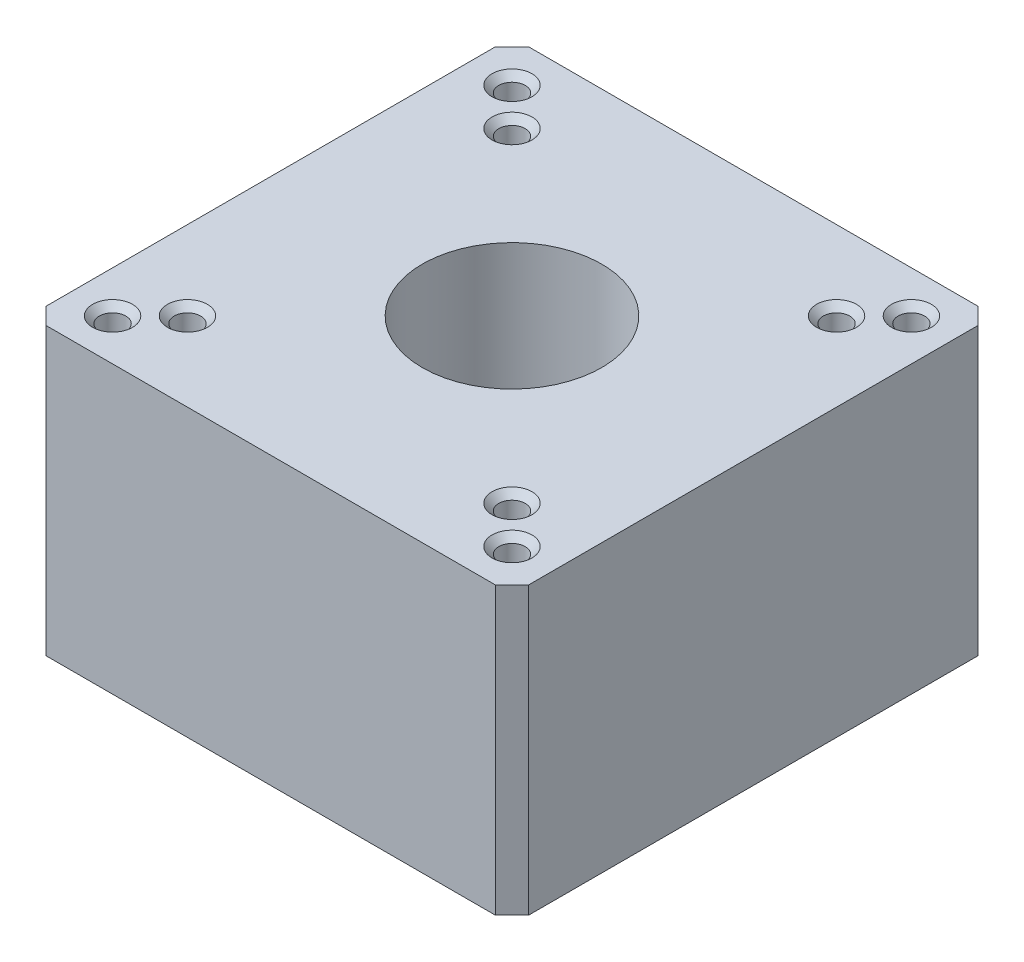
ISO-10303-21;
HEADER;
FILE_DESCRIPTION(('STEP AP214'),'2;1');
FILE_NAME('part.step','',(''),(''),'','','');
FILE_SCHEMA(('AUTOMOTIVE_DESIGN { 1 0 10303 214 1 1 1 1 }'));
ENDSEC;
DATA;
#1=APPLICATION_CONTEXT('core data for automotive mechanical design processes');
#2=APPLICATION_PROTOCOL_DEFINITION('international standard','automotive_design',2000,#1);
#3=PRODUCT_CONTEXT('',#1,'mechanical');
#4=PRODUCT('Part','Part','',(#3));
#5=PRODUCT_RELATED_PRODUCT_CATEGORY('part','',(#4));
#6=PRODUCT_DEFINITION_FORMATION('','',#4);
#7=PRODUCT_DEFINITION_CONTEXT('part definition',#1,'design');
#8=PRODUCT_DEFINITION('design','',#6,#7);
#9=PRODUCT_DEFINITION_SHAPE('','',#8);
#10=(LENGTH_UNIT() NAMED_UNIT(*) SI_UNIT(.MILLI.,.METRE.));
#11=(NAMED_UNIT(*) PLANE_ANGLE_UNIT() SI_UNIT($,.RADIAN.));
#12=(NAMED_UNIT(*) SI_UNIT($,.STERADIAN.) SOLID_ANGLE_UNIT());
#13=UNCERTAINTY_MEASURE_WITH_UNIT(LENGTH_MEASURE(1.E-05),#10,'distance_accuracy_value','');
#14=(GEOMETRIC_REPRESENTATION_CONTEXT(3) GLOBAL_UNCERTAINTY_ASSIGNED_CONTEXT((#13)) GLOBAL_UNIT_ASSIGNED_CONTEXT((#10,
#11,#12)) REPRESENTATION_CONTEXT('',''));
#15=CARTESIAN_POINT('',(0.,0.,0.));
#16=DIRECTION('',(0.,0.,1.));
#17=DIRECTION('',(1.,0.,0.));
#18=AXIS2_PLACEMENT_3D('',#15,#16,#17);
#19=CARTESIAN_POINT('',(0.,43.65625,0.));
#20=DIRECTION('',(0.,1.,0.));
#21=DIRECTION('',(0.,0.,1.));
#22=AXIS2_PLACEMENT_3D('',#19,#20,#21);
#23=PLANE('',#22);
#24=CARTESIAN_POINT('',(-24.765,43.65625,-24.765));
#25=DIRECTION('',(0.,1.,0.));
#26=DIRECTION('',(0.,0.,1.));
#27=AXIS2_PLACEMENT_3D('',#24,#25,#26);
#28=CIRCLE('',#27,3.048);
#29=CARTESIAN_POINT('',(-24.765,43.65625,-21.717));
#30=VERTEX_POINT('',#29);
#31=EDGE_CURVE('E153',#30,#30,#28,.T.);
#32=ORIENTED_EDGE('',*,*,#31,.F.);
#33=EDGE_LOOP('',(#32));
#34=FACE_BOUND('',#33,.T.);
#35=CARTESIAN_POINT('',(24.765,43.65625,-24.765));
#36=DIRECTION('',(0.,1.,0.));
#37=DIRECTION('',(0.,0.,1.));
#38=AXIS2_PLACEMENT_3D('',#35,#36,#37);
#39=CIRCLE('',#38,3.048);
#40=CARTESIAN_POINT('',(24.765,43.65625,-21.717));
#41=VERTEX_POINT('',#40);
#42=EDGE_CURVE('E144',#41,#41,#39,.T.);
#43=ORIENTED_EDGE('',*,*,#42,.F.);
#44=EDGE_LOOP('',(#43));
#45=FACE_BOUND('',#44,.T.);
#46=CARTESIAN_POINT('',(-24.765,43.65625,24.765));
#47=DIRECTION('',(0.,1.,0.));
#48=DIRECTION('',(0.,0.,1.));
#49=AXIS2_PLACEMENT_3D('',#46,#47,#48);
#50=CIRCLE('',#49,3.048);
#51=CARTESIAN_POINT('',(-24.765,43.65625,27.813));
#52=VERTEX_POINT('',#51);
#53=EDGE_CURVE('E165',#52,#52,#50,.T.);
#54=ORIENTED_EDGE('',*,*,#53,.F.);
#55=EDGE_LOOP('',(#54));
#56=FACE_BOUND('',#55,.T.);
#57=CARTESIAN_POINT('',(24.765,43.65625,24.765));
#58=DIRECTION('',(0.,1.,0.));
#59=DIRECTION('',(0.,0.,1.));
#60=AXIS2_PLACEMENT_3D('',#57,#58,#59);
#61=CIRCLE('',#60,3.048);
#62=CARTESIAN_POINT('',(24.765,43.65625,27.813));
#63=VERTEX_POINT('',#62);
#64=EDGE_CURVE('E176',#63,#63,#61,.T.);
#65=ORIENTED_EDGE('',*,*,#64,.F.);
#66=EDGE_LOOP('',(#65));
#67=FACE_BOUND('',#66,.T.);
#68=CARTESIAN_POINT('',(30.48,43.65625,-30.48));
#69=DIRECTION('',(0.,1.,0.));
#70=DIRECTION('',(0.,0.,1.));
#71=AXIS2_PLACEMENT_3D('',#68,#69,#70);
#72=CIRCLE('',#71,3.048);
#73=CARTESIAN_POINT('',(30.48,43.65625,-27.432));
#74=VERTEX_POINT('',#73);
#75=EDGE_CURVE('E189',#74,#74,#72,.T.);
#76=ORIENTED_EDGE('',*,*,#75,.F.);
#77=EDGE_LOOP('',(#76));
#78=FACE_BOUND('',#77,.T.);
#79=CARTESIAN_POINT('',(-30.48,43.65625,-30.48));
#80=DIRECTION('',(0.,1.,0.));
#81=DIRECTION('',(0.,0.,1.));
#82=AXIS2_PLACEMENT_3D('',#79,#80,#81);
#83=CIRCLE('',#82,3.048);
#84=CARTESIAN_POINT('',(-30.48,43.65625,-27.432));
#85=VERTEX_POINT('',#84);
#86=EDGE_CURVE('E199',#85,#85,#83,.T.);
#87=ORIENTED_EDGE('',*,*,#86,.F.);
#88=EDGE_LOOP('',(#87));
#89=FACE_BOUND('',#88,.T.);
#90=CARTESIAN_POINT('',(-30.48,43.65625,30.48));
#91=DIRECTION('',(0.,1.,0.));
#92=DIRECTION('',(0.,0.,1.));
#93=AXIS2_PLACEMENT_3D('',#90,#91,#92);
#94=CIRCLE('',#93,3.048);
#95=CARTESIAN_POINT('',(-30.48,43.65625,33.528));
#96=VERTEX_POINT('',#95);
#97=EDGE_CURVE('E215',#96,#96,#94,.T.);
#98=ORIENTED_EDGE('',*,*,#97,.F.);
#99=EDGE_LOOP('',(#98));
#100=FACE_BOUND('',#99,.T.);
#101=CARTESIAN_POINT('',(30.48,43.65625,30.48));
#102=DIRECTION('',(0.,1.,0.));
#103=DIRECTION('',(0.,0.,1.));
#104=AXIS2_PLACEMENT_3D('',#101,#102,#103);
#105=CIRCLE('',#104,3.048);
#106=CARTESIAN_POINT('',(30.48,43.65625,33.528));
#107=VERTEX_POINT('',#106);
#108=EDGE_CURVE('E223',#107,#107,#105,.T.);
#109=ORIENTED_EDGE('',*,*,#108,.F.);
#110=EDGE_LOOP('',(#109));
#111=FACE_BOUND('',#110,.T.);
#112=DIRECTION('',(0.,0.,-1.));
#113=VECTOR('',#112,1.);
#114=CARTESIAN_POINT('',(36.83,43.65625,36.83));
#115=LINE('',#114,#113);
#116=CARTESIAN_POINT('',(36.83,43.65625,34.29));
#117=VERTEX_POINT('',#116);
#118=CARTESIAN_POINT('',(36.83,43.65625,-34.29));
#119=VERTEX_POINT('',#118);
#120=EDGE_CURVE('E255',#117,#119,#115,.T.);
#121=ORIENTED_EDGE('',*,*,#120,.T.);
#122=DIRECTION('',(0.707106781186548,0.,0.707106781186548));
#123=VECTOR('',#122,1.);
#124=CARTESIAN_POINT('',(35.56,43.65625,-35.56));
#125=LINE('',#124,#123);
#126=CARTESIAN_POINT('',(34.29,43.65625,-36.83));
#127=VERTEX_POINT('',#126);
#128=EDGE_CURVE('E310',#119,#127,#125,.F.);
#129=ORIENTED_EDGE('',*,*,#128,.T.);
#130=DIRECTION('',(-1.,0.,0.));
#131=VECTOR('',#130,1.);
#132=CARTESIAN_POINT('',(36.83,43.65625,-36.83));
#133=LINE('',#132,#131);
#134=CARTESIAN_POINT('',(-34.29,43.65625,-36.83));
#135=VERTEX_POINT('',#134);
#136=EDGE_CURVE('E257',#127,#135,#133,.T.);
#137=ORIENTED_EDGE('',*,*,#136,.T.);
#138=DIRECTION('',(0.707106781186548,0.,-0.707106781186548));
#139=VECTOR('',#138,1.);
#140=CARTESIAN_POINT('',(-35.56,43.65625,-35.56));
#141=LINE('',#140,#139);
#142=CARTESIAN_POINT('',(-36.83,43.65625,-34.29));
#143=VERTEX_POINT('',#142);
#144=EDGE_CURVE('E302',#135,#143,#141,.F.);
#145=ORIENTED_EDGE('',*,*,#144,.T.);
#146=DIRECTION('',(0.,0.,1.));
#147=VECTOR('',#146,1.);
#148=CARTESIAN_POINT('',(-36.83,43.65625,36.83));
#149=LINE('',#148,#147);
#150=CARTESIAN_POINT('',(-36.83,43.65625,34.29));
#151=VERTEX_POINT('',#150);
#152=EDGE_CURVE('E244',#143,#151,#149,.T.);
#153=ORIENTED_EDGE('',*,*,#152,.T.);
#154=DIRECTION('',(-0.707106781186548,0.,-0.707106781186548));
#155=VECTOR('',#154,1.);
#156=CARTESIAN_POINT('',(-35.56,43.65625,35.56));
#157=LINE('',#156,#155);
#158=CARTESIAN_POINT('',(-34.29,43.65625,36.83));
#159=VERTEX_POINT('',#158);
#160=EDGE_CURVE('E76',#151,#159,#157,.F.);
#161=ORIENTED_EDGE('',*,*,#160,.T.);
#162=DIRECTION('',(1.,0.,0.));
#163=VECTOR('',#162,1.);
#164=CARTESIAN_POINT('',(36.83,43.65625,36.83));
#165=LINE('',#164,#163);
#166=CARTESIAN_POINT('',(34.29,43.65625,36.83));
#167=VERTEX_POINT('',#166);
#168=EDGE_CURVE('E247',#159,#167,#165,.T.);
#169=ORIENTED_EDGE('',*,*,#168,.T.);
#170=DIRECTION('',(-0.707106781186549,0.,0.707106781186546));
#171=VECTOR('',#170,1.);
#172=CARTESIAN_POINT('',(35.5599999999999,43.65625,35.5600000000001));
#173=LINE('',#172,#171);
#174=EDGE_CURVE('E299',#167,#117,#173,.F.);
#175=ORIENTED_EDGE('',*,*,#174,.T.);
#176=EDGE_LOOP('',(#121,#129,#137,#145,#153,#161,#169,#175));
#177=FACE_BOUND('',#176,.T.);
#178=CARTESIAN_POINT('',(0.,43.65625,0.));
#179=DIRECTION('',(0.,1.,0.));
#180=DIRECTION('',(0.,0.,1.));
#181=AXIS2_PLACEMENT_3D('',#178,#179,#180);
#182=CIRCLE('',#181,13.6921875);
#183=CARTESIAN_POINT('',(0.,43.65625,13.6921875));
#184=VERTEX_POINT('',#183);
#185=EDGE_CURVE('E240',#184,#184,#182,.T.);
#186=ORIENTED_EDGE('',*,*,#185,.F.);
#187=EDGE_LOOP('',(#186));
#188=FACE_BOUND('',#187,.T.);
#189=ADVANCED_FACE('F54',(#34,#45,#56,#67,#78,#89,#100,#111,#177,#188),#23,.T.);
#190=CARTESIAN_POINT('',(0.,0.,0.));
#191=DIRECTION('',(0.,1.,0.));
#192=DIRECTION('',(0.,0.,1.));
#193=AXIS2_PLACEMENT_3D('',#190,#191,#192);
#194=PLANE('',#193);
#195=CARTESIAN_POINT('',(30.48,0.,-30.48));
#196=DIRECTION('',(0.,1.,0.));
#197=DIRECTION('',(0.,0.,1.));
#198=AXIS2_PLACEMENT_3D('',#195,#196,#197);
#199=CIRCLE('',#198,2.01929999999999);
#200=CARTESIAN_POINT('',(30.48,0.,-28.4607));
#201=VERTEX_POINT('',#200);
#202=EDGE_CURVE('E196',#201,#201,#199,.T.);
#203=ORIENTED_EDGE('',*,*,#202,.T.);
#204=EDGE_LOOP('',(#203));
#205=FACE_BOUND('',#204,.T.);
#206=CARTESIAN_POINT('',(-30.48,0.,-30.48));
#207=DIRECTION('',(0.,1.,0.));
#208=DIRECTION('',(0.,0.,1.));
#209=AXIS2_PLACEMENT_3D('',#206,#207,#208);
#210=CIRCLE('',#209,2.01929999999999);
#211=CARTESIAN_POINT('',(-30.48,0.,-28.4607));
#212=VERTEX_POINT('',#211);
#213=EDGE_CURVE('E206',#212,#212,#210,.T.);
#214=ORIENTED_EDGE('',*,*,#213,.T.);
#215=EDGE_LOOP('',(#214));
#216=FACE_BOUND('',#215,.T.);
#217=CARTESIAN_POINT('',(-30.48,0.,30.48));
#218=DIRECTION('',(0.,1.,0.));
#219=DIRECTION('',(0.,0.,1.));
#220=AXIS2_PLACEMENT_3D('',#217,#218,#219);
#221=CIRCLE('',#220,2.01929999999999);
#222=CARTESIAN_POINT('',(-30.48,0.,32.4993));
#223=VERTEX_POINT('',#222);
#224=EDGE_CURVE('E219',#223,#223,#221,.T.);
#225=ORIENTED_EDGE('',*,*,#224,.T.);
#226=EDGE_LOOP('',(#225));
#227=FACE_BOUND('',#226,.T.);
#228=CARTESIAN_POINT('',(30.48,0.,30.48));
#229=DIRECTION('',(0.,1.,0.));
#230=DIRECTION('',(0.,0.,1.));
#231=AXIS2_PLACEMENT_3D('',#228,#229,#230);
#232=CIRCLE('',#231,2.01929999999999);
#233=CARTESIAN_POINT('',(30.48,0.,32.4993));
#234=VERTEX_POINT('',#233);
#235=EDGE_CURVE('E235',#234,#234,#232,.T.);
#236=ORIENTED_EDGE('',*,*,#235,.T.);
#237=EDGE_LOOP('',(#236));
#238=FACE_BOUND('',#237,.T.);
#239=DIRECTION('',(-1.,0.,0.));
#240=VECTOR('',#239,1.);
#241=CARTESIAN_POINT('',(36.83,0.,-36.83));
#242=LINE('',#241,#240);
#243=CARTESIAN_POINT('',(34.29,0.,-36.83));
#244=VERTEX_POINT('',#243);
#245=CARTESIAN_POINT('',(-34.29,0.,-36.83));
#246=VERTEX_POINT('',#245);
#247=EDGE_CURVE('E248',#244,#246,#242,.T.);
#248=ORIENTED_EDGE('',*,*,#247,.F.);
#249=DIRECTION('',(-0.707106781186548,0.,-0.707106781186548));
#250=VECTOR('',#249,1.);
#251=CARTESIAN_POINT('',(34.29,0.,-36.83));
#252=LINE('',#251,#250);
#253=CARTESIAN_POINT('',(36.83,0.,-34.29));
#254=VERTEX_POINT('',#253);
#255=EDGE_CURVE('E288',#244,#254,#252,.F.);
#256=ORIENTED_EDGE('',*,*,#255,.T.);
#257=DIRECTION('',(0.,0.,-1.));
#258=VECTOR('',#257,1.);
#259=CARTESIAN_POINT('',(36.83,0.,36.83));
#260=LINE('',#259,#258);
#261=CARTESIAN_POINT('',(36.83,0.,34.29));
#262=VERTEX_POINT('',#261);
#263=EDGE_CURVE('E270',#262,#254,#260,.T.);
#264=ORIENTED_EDGE('',*,*,#263,.F.);
#265=DIRECTION('',(0.707106781186549,0.,-0.707106781186546));
#266=VECTOR('',#265,1.);
#267=CARTESIAN_POINT('',(36.83,0.,34.29));
#268=LINE('',#267,#266);
#269=CARTESIAN_POINT('',(34.29,0.,36.83));
#270=VERTEX_POINT('',#269);
#271=EDGE_CURVE('E278',#262,#270,#268,.F.);
#272=ORIENTED_EDGE('',*,*,#271,.T.);
#273=DIRECTION('',(1.,0.,0.));
#274=VECTOR('',#273,1.);
#275=CARTESIAN_POINT('',(36.83,0.,36.83));
#276=LINE('',#275,#274);
#277=CARTESIAN_POINT('',(-34.29,0.,36.83));
#278=VERTEX_POINT('',#277);
#279=EDGE_CURVE('E262',#278,#270,#276,.T.);
#280=ORIENTED_EDGE('',*,*,#279,.F.);
#281=DIRECTION('',(0.707106781186548,0.,0.707106781186548));
#282=VECTOR('',#281,1.);
#283=CARTESIAN_POINT('',(-34.29,0.,36.83));
#284=LINE('',#283,#282);
#285=CARTESIAN_POINT('',(-36.83,0.,34.29));
#286=VERTEX_POINT('',#285);
#287=EDGE_CURVE('E283',#278,#286,#284,.F.);
#288=ORIENTED_EDGE('',*,*,#287,.T.);
#289=DIRECTION('',(0.,0.,1.));
#290=VECTOR('',#289,1.);
#291=CARTESIAN_POINT('',(-36.83,0.,36.83));
#292=LINE('',#291,#290);
#293=CARTESIAN_POINT('',(-36.83,0.,-34.29));
#294=VERTEX_POINT('',#293);
#295=EDGE_CURVE('E241',#294,#286,#292,.T.);
#296=ORIENTED_EDGE('',*,*,#295,.F.);
#297=DIRECTION('',(-0.707106781186548,0.,0.707106781186548));
#298=VECTOR('',#297,1.);
#299=CARTESIAN_POINT('',(-36.83,0.,-34.29));
#300=LINE('',#299,#298);
#301=EDGE_CURVE('E286',#294,#246,#300,.F.);
#302=ORIENTED_EDGE('',*,*,#301,.T.);
#303=EDGE_LOOP('',(#248,#256,#264,#272,#280,#288,#296,#302));
#304=FACE_BOUND('',#303,.T.);
#305=CARTESIAN_POINT('',(0.,0.,0.));
#306=DIRECTION('',(0.,1.,0.));
#307=DIRECTION('',(0.,0.,1.));
#308=AXIS2_PLACEMENT_3D('',#305,#306,#307);
#309=CIRCLE('',#308,13.6921875);
#310=CARTESIAN_POINT('',(0.,0.,13.6921875));
#311=VERTEX_POINT('',#310);
#312=EDGE_CURVE('E236',#311,#311,#309,.T.);
#313=ORIENTED_EDGE('',*,*,#312,.T.);
#314=EDGE_LOOP('',(#313));
#315=FACE_BOUND('',#314,.T.);
#316=ADVANCED_FACE('F330',(#205,#216,#227,#238,#304,#315),#194,.F.);
#317=CARTESIAN_POINT('',(-36.83,43.65625,36.83));
#318=DIRECTION('',(1.,0.,0.));
#319=DIRECTION('',(0.,0.,-1.));
#320=AXIS2_PLACEMENT_3D('',#317,#318,#319);
#321=PLANE('',#320);
#322=ORIENTED_EDGE('',*,*,#152,.F.);
#323=DIRECTION('',(0.,-1.,0.));
#324=VECTOR('',#323,1.);
#325=CARTESIAN_POINT('',(-36.83,43.65625,-34.29));
#326=LINE('',#325,#324);
#327=EDGE_CURVE('E312',#143,#294,#326,.T.);
#328=ORIENTED_EDGE('',*,*,#327,.T.);
#329=ORIENTED_EDGE('',*,*,#295,.T.);
#330=DIRECTION('',(0.,1.,0.));
#331=VECTOR('',#330,1.);
#332=CARTESIAN_POINT('',(-36.83,43.65625,34.29));
#333=LINE('',#332,#331);
#334=EDGE_CURVE('E309',#286,#151,#333,.T.);
#335=ORIENTED_EDGE('',*,*,#334,.T.);
#336=EDGE_LOOP('',(#322,#328,#329,#335));
#337=FACE_BOUND('',#336,.T.);
#338=ADVANCED_FACE('F322',(#337),#321,.F.);
#339=CARTESIAN_POINT('',(36.83,43.65625,36.83));
#340=DIRECTION('',(0.,0.,-1.));
#341=DIRECTION('',(-1.,0.,0.));
#342=AXIS2_PLACEMENT_3D('',#339,#340,#341);
#343=PLANE('',#342);
#344=ORIENTED_EDGE('',*,*,#168,.F.);
#345=DIRECTION('',(0.,-1.,0.));
#346=VECTOR('',#345,1.);
#347=CARTESIAN_POINT('',(-34.29,43.65625,36.83));
#348=LINE('',#347,#346);
#349=EDGE_CURVE('E11',#159,#278,#348,.T.);
#350=ORIENTED_EDGE('',*,*,#349,.T.);
#351=ORIENTED_EDGE('',*,*,#279,.T.);
#352=DIRECTION('',(0.,1.,0.));
#353=VECTOR('',#352,1.);
#354=CARTESIAN_POINT('',(34.29,43.65625,36.83));
#355=LINE('',#354,#353);
#356=EDGE_CURVE('E63',#270,#167,#355,.T.);
#357=ORIENTED_EDGE('',*,*,#356,.T.);
#358=EDGE_LOOP('',(#344,#350,#351,#357));
#359=FACE_BOUND('',#358,.T.);
#360=ADVANCED_FACE('F332',(#359),#343,.F.);
#361=CARTESIAN_POINT('',(36.83,43.65625,36.83));
#362=DIRECTION('',(-1.,0.,0.));
#363=DIRECTION('',(0.,0.,1.));
#364=AXIS2_PLACEMENT_3D('',#361,#362,#363);
#365=PLANE('',#364);
#366=ORIENTED_EDGE('',*,*,#263,.T.);
#367=DIRECTION('',(0.,1.,0.));
#368=VECTOR('',#367,1.);
#369=CARTESIAN_POINT('',(36.83,43.65625,-34.29));
#370=LINE('',#369,#368);
#371=EDGE_CURVE('E298',#254,#119,#370,.T.);
#372=ORIENTED_EDGE('',*,*,#371,.T.);
#373=ORIENTED_EDGE('',*,*,#120,.F.);
#374=DIRECTION('',(0.,-1.,0.));
#375=VECTOR('',#374,1.);
#376=CARTESIAN_POINT('',(36.83,43.65625,34.29));
#377=LINE('',#376,#375);
#378=EDGE_CURVE('E292',#117,#262,#377,.T.);
#379=ORIENTED_EDGE('',*,*,#378,.T.);
#380=EDGE_LOOP('',(#366,#372,#373,#379));
#381=FACE_BOUND('',#380,.T.);
#382=ADVANCED_FACE('F342',(#381),#365,.F.);
#383=CARTESIAN_POINT('',(36.83,43.65625,-36.83));
#384=DIRECTION('',(0.,0.,1.));
#385=DIRECTION('',(1.,0.,0.));
#386=AXIS2_PLACEMENT_3D('',#383,#384,#385);
#387=PLANE('',#386);
#388=ORIENTED_EDGE('',*,*,#136,.F.);
#389=DIRECTION('',(0.,-1.,0.));
#390=VECTOR('',#389,1.);
#391=CARTESIAN_POINT('',(34.29,43.65625,-36.83));
#392=LINE('',#391,#390);
#393=EDGE_CURVE('E277',#127,#244,#392,.T.);
#394=ORIENTED_EDGE('',*,*,#393,.T.);
#395=ORIENTED_EDGE('',*,*,#247,.T.);
#396=DIRECTION('',(0.,1.,0.));
#397=VECTOR('',#396,1.);
#398=CARTESIAN_POINT('',(-34.29,43.65625,-36.83));
#399=LINE('',#398,#397);
#400=EDGE_CURVE('E258',#246,#135,#399,.T.);
#401=ORIENTED_EDGE('',*,*,#400,.T.);
#402=EDGE_LOOP('',(#388,#394,#395,#401));
#403=FACE_BOUND('',#402,.T.);
#404=ADVANCED_FACE('F347',(#403),#387,.F.);
#405=CARTESIAN_POINT('',(0.,43.65625,0.));
#406=DIRECTION('',(0.,-1.,0.));
#407=DIRECTION('',(0.,0.,-1.));
#408=AXIS2_PLACEMENT_3D('',#405,#406,#407);
#409=CYLINDRICAL_SURFACE('',#408,13.6921875);
#410=ORIENTED_EDGE('',*,*,#185,.T.);
#411=EDGE_LOOP('',(#410));
#412=FACE_BOUND('',#411,.T.);
#413=ORIENTED_EDGE('',*,*,#312,.F.);
#414=EDGE_LOOP('',(#413));
#415=FACE_BOUND('',#414,.T.);
#416=ADVANCED_FACE('F356',(#412,#415),#409,.F.);
#417=CARTESIAN_POINT('',(34.29,43.65625,-36.83));
#418=DIRECTION('',(-0.707106781186548,0.,0.707106781186548));
#419=DIRECTION('',(0.,-1.,0.));
#420=AXIS2_PLACEMENT_3D('',#417,#418,#419);
#421=PLANE('',#420);
#422=ORIENTED_EDGE('',*,*,#128,.F.);
#423=ORIENTED_EDGE('',*,*,#371,.F.);
#424=ORIENTED_EDGE('',*,*,#255,.F.);
#425=ORIENTED_EDGE('',*,*,#393,.F.);
#426=EDGE_LOOP('',(#422,#423,#424,#425));
#427=FACE_BOUND('',#426,.T.);
#428=ADVANCED_FACE('F346',(#427),#421,.F.);
#429=CARTESIAN_POINT('',(-36.83,43.65625,-34.29));
#430=DIRECTION('',(0.707106781186548,0.,0.707106781186548));
#431=DIRECTION('',(0.,-1.,0.));
#432=AXIS2_PLACEMENT_3D('',#429,#430,#431);
#433=PLANE('',#432);
#434=ORIENTED_EDGE('',*,*,#144,.F.);
#435=ORIENTED_EDGE('',*,*,#400,.F.);
#436=ORIENTED_EDGE('',*,*,#301,.F.);
#437=ORIENTED_EDGE('',*,*,#327,.F.);
#438=EDGE_LOOP('',(#434,#435,#436,#437));
#439=FACE_BOUND('',#438,.T.);
#440=ADVANCED_FACE('F351',(#439),#433,.F.);
#441=CARTESIAN_POINT('',(-34.29,43.65625,36.83));
#442=DIRECTION('',(0.707106781186548,0.,-0.707106781186548));
#443=DIRECTION('',(0.,-1.,0.));
#444=AXIS2_PLACEMENT_3D('',#441,#442,#443);
#445=PLANE('',#444);
#446=ORIENTED_EDGE('',*,*,#160,.F.);
#447=ORIENTED_EDGE('',*,*,#334,.F.);
#448=ORIENTED_EDGE('',*,*,#287,.F.);
#449=ORIENTED_EDGE('',*,*,#349,.F.);
#450=EDGE_LOOP('',(#446,#447,#448,#449));
#451=FACE_BOUND('',#450,.T.);
#452=ADVANCED_FACE('F335',(#451),#445,.F.);
#453=CARTESIAN_POINT('',(36.83,43.65625,34.29));
#454=DIRECTION('',(-0.707106781186546,0.,-0.707106781186549));
#455=DIRECTION('',(0.,-1.,0.));
#456=AXIS2_PLACEMENT_3D('',#453,#454,#455);
#457=PLANE('',#456);
#458=ORIENTED_EDGE('',*,*,#174,.F.);
#459=ORIENTED_EDGE('',*,*,#356,.F.);
#460=ORIENTED_EDGE('',*,*,#271,.F.);
#461=ORIENTED_EDGE('',*,*,#378,.F.);
#462=EDGE_LOOP('',(#458,#459,#460,#461));
#463=FACE_BOUND('',#462,.T.);
#464=ADVANCED_FACE('F59',(#463),#457,.F.);
#465=CARTESIAN_POINT('',(30.48,43.65625,30.48));
#466=DIRECTION('',(0.,1.,0.));
#467=DIRECTION('',(0.,0.,1.));
#468=AXIS2_PLACEMENT_3D('',#465,#466,#467);
#469=CYLINDRICAL_SURFACE('',#468,2.01929999999999);
#470=ORIENTED_EDGE('',*,*,#235,.F.);
#471=EDGE_LOOP('',(#470));
#472=FACE_BOUND('',#471,.T.);
#473=CARTESIAN_POINT('',(30.48,42.62755,30.48));
#474=DIRECTION('',(0.,1.,0.));
#475=DIRECTION('',(0.,0.,1.));
#476=AXIS2_PLACEMENT_3D('',#473,#474,#475);
#477=CIRCLE('',#476,2.0193);
#478=CARTESIAN_POINT('',(30.48,42.62755,32.4993));
#479=VERTEX_POINT('',#478);
#480=EDGE_CURVE('E226',#479,#479,#477,.T.);
#481=ORIENTED_EDGE('',*,*,#480,.T.);
#482=EDGE_LOOP('',(#481));
#483=FACE_BOUND('',#482,.T.);
#484=ADVANCED_FACE('F445',(#472,#483),#469,.F.);
#485=CARTESIAN_POINT('',(30.48,43.65625,30.48));
#486=DIRECTION('',(0.,1.,0.));
#487=DIRECTION('',(0.,0.,1.));
#488=AXIS2_PLACEMENT_3D('',#485,#486,#487);
#489=CONICAL_SURFACE('',#488,3.048,0.785398163397448);
#490=ORIENTED_EDGE('',*,*,#480,.F.);
#491=EDGE_LOOP('',(#490));
#492=FACE_BOUND('',#491,.T.);
#493=ORIENTED_EDGE('',*,*,#108,.T.);
#494=EDGE_LOOP('',(#493));
#495=FACE_BOUND('',#494,.T.);
#496=ADVANCED_FACE('F452',(#492,#495),#489,.F.);
#497=CARTESIAN_POINT('',(-30.48,43.65625,30.48));
#498=DIRECTION('',(0.,1.,0.));
#499=DIRECTION('',(0.,0.,1.));
#500=AXIS2_PLACEMENT_3D('',#497,#498,#499);
#501=CYLINDRICAL_SURFACE('',#500,2.01929999999999);
#502=ORIENTED_EDGE('',*,*,#224,.F.);
#503=EDGE_LOOP('',(#502));
#504=FACE_BOUND('',#503,.T.);
#505=CARTESIAN_POINT('',(-30.48,42.62755,30.48));
#506=DIRECTION('',(0.,1.,0.));
#507=DIRECTION('',(0.,0.,1.));
#508=AXIS2_PLACEMENT_3D('',#505,#506,#507);
#509=CIRCLE('',#508,2.0193);
#510=CARTESIAN_POINT('',(-30.48,42.62755,32.4993));
#511=VERTEX_POINT('',#510);
#512=EDGE_CURVE('E216',#511,#511,#509,.T.);
#513=ORIENTED_EDGE('',*,*,#512,.T.);
#514=EDGE_LOOP('',(#513));
#515=FACE_BOUND('',#514,.T.);
#516=ADVANCED_FACE('F465',(#504,#515),#501,.F.);
#517=CARTESIAN_POINT('',(-30.48,43.65625,30.48));
#518=DIRECTION('',(0.,1.,0.));
#519=DIRECTION('',(0.,0.,1.));
#520=AXIS2_PLACEMENT_3D('',#517,#518,#519);
#521=CONICAL_SURFACE('',#520,3.048,0.785398163397448);
#522=ORIENTED_EDGE('',*,*,#512,.F.);
#523=EDGE_LOOP('',(#522));
#524=FACE_BOUND('',#523,.T.);
#525=ORIENTED_EDGE('',*,*,#97,.T.);
#526=EDGE_LOOP('',(#525));
#527=FACE_BOUND('',#526,.T.);
#528=ADVANCED_FACE('F474',(#524,#527),#521,.F.);
#529=CARTESIAN_POINT('',(-30.48,43.65625,-30.48));
#530=DIRECTION('',(0.,1.,0.));
#531=DIRECTION('',(0.,0.,1.));
#532=AXIS2_PLACEMENT_3D('',#529,#530,#531);
#533=CYLINDRICAL_SURFACE('',#532,2.01929999999999);
#534=ORIENTED_EDGE('',*,*,#213,.F.);
#535=EDGE_LOOP('',(#534));
#536=FACE_BOUND('',#535,.T.);
#537=CARTESIAN_POINT('',(-30.48,42.62755,-30.48));
#538=DIRECTION('',(0.,1.,0.));
#539=DIRECTION('',(0.,0.,1.));
#540=AXIS2_PLACEMENT_3D('',#537,#538,#539);
#541=CIRCLE('',#540,2.0193);
#542=CARTESIAN_POINT('',(-30.48,42.62755,-28.4607));
#543=VERTEX_POINT('',#542);
#544=EDGE_CURVE('E203',#543,#543,#541,.T.);
#545=ORIENTED_EDGE('',*,*,#544,.T.);
#546=EDGE_LOOP('',(#545));
#547=FACE_BOUND('',#546,.T.);
#548=ADVANCED_FACE('F484',(#536,#547),#533,.F.);
#549=CARTESIAN_POINT('',(-30.48,43.65625,-30.48));
#550=DIRECTION('',(0.,1.,0.));
#551=DIRECTION('',(0.,0.,1.));
#552=AXIS2_PLACEMENT_3D('',#549,#550,#551);
#553=CONICAL_SURFACE('',#552,3.048,0.785398163397448);
#554=ORIENTED_EDGE('',*,*,#544,.F.);
#555=EDGE_LOOP('',(#554));
#556=FACE_BOUND('',#555,.T.);
#557=ORIENTED_EDGE('',*,*,#86,.T.);
#558=EDGE_LOOP('',(#557));
#559=FACE_BOUND('',#558,.T.);
#560=ADVANCED_FACE('F496',(#556,#559),#553,.F.);
#561=CARTESIAN_POINT('',(30.48,43.65625,-30.48));
#562=DIRECTION('',(0.,1.,0.));
#563=DIRECTION('',(0.,0.,1.));
#564=AXIS2_PLACEMENT_3D('',#561,#562,#563);
#565=CYLINDRICAL_SURFACE('',#564,2.01929999999999);
#566=ORIENTED_EDGE('',*,*,#202,.F.);
#567=EDGE_LOOP('',(#566));
#568=FACE_BOUND('',#567,.T.);
#569=CARTESIAN_POINT('',(30.48,42.62755,-30.48));
#570=DIRECTION('',(0.,1.,0.));
#571=DIRECTION('',(0.,0.,1.));
#572=AXIS2_PLACEMENT_3D('',#569,#570,#571);
#573=CIRCLE('',#572,2.0193);
#574=CARTESIAN_POINT('',(30.48,42.62755,-28.4607));
#575=VERTEX_POINT('',#574);
#576=EDGE_CURVE('E195',#575,#575,#573,.T.);
#577=ORIENTED_EDGE('',*,*,#576,.T.);
#578=EDGE_LOOP('',(#577));
#579=FACE_BOUND('',#578,.T.);
#580=ADVANCED_FACE('F507',(#568,#579),#565,.F.);
#581=CARTESIAN_POINT('',(30.48,43.65625,-30.48));
#582=DIRECTION('',(0.,1.,0.));
#583=DIRECTION('',(0.,0.,1.));
#584=AXIS2_PLACEMENT_3D('',#581,#582,#583);
#585=CONICAL_SURFACE('',#584,3.048,0.785398163397448);
#586=ORIENTED_EDGE('',*,*,#576,.F.);
#587=EDGE_LOOP('',(#586));
#588=FACE_BOUND('',#587,.T.);
#589=ORIENTED_EDGE('',*,*,#75,.T.);
#590=EDGE_LOOP('',(#589));
#591=FACE_BOUND('',#590,.T.);
#592=ADVANCED_FACE('F516',(#588,#591),#585,.F.);
#593=CARTESIAN_POINT('',(24.765,21.81225,24.765));
#594=DIRECTION('',(0.,1.,0.));
#595=DIRECTION('',(0.,0.,1.));
#596=AXIS2_PLACEMENT_3D('',#593,#594,#595);
#597=CONICAL_SURFACE('',#596,2.0193,1.02974425867665);
#598=CARTESIAN_POINT('',(24.765,20.5989321519976,24.765));
#599=VERTEX_POINT('',#598);
#600=VERTEX_LOOP('',#599);
#601=FACE_BOUND('',#600,.T.);
#602=CARTESIAN_POINT('',(24.765,21.81225,24.765));
#603=DIRECTION('',(0.,1.,0.));
#604=DIRECTION('',(0.,0.,1.));
#605=AXIS2_PLACEMENT_3D('',#602,#603,#604);
#606=CIRCLE('',#605,2.0193);
#607=CARTESIAN_POINT('',(24.765,21.81225,26.7843));
#608=VERTEX_POINT('',#607);
#609=EDGE_CURVE('E183',#608,#608,#606,.T.);
#610=ORIENTED_EDGE('',*,*,#609,.T.);
#611=EDGE_LOOP('',(#610));
#612=FACE_BOUND('',#611,.T.);
#613=ADVANCED_FACE('F529',(#601,#612),#597,.F.);
#614=CARTESIAN_POINT('',(24.765,43.65625,24.765));
#615=DIRECTION('',(0.,1.,0.));
#616=DIRECTION('',(0.,0.,1.));
#617=AXIS2_PLACEMENT_3D('',#614,#615,#616);
#618=CYLINDRICAL_SURFACE('',#617,2.0193);
#619=ORIENTED_EDGE('',*,*,#609,.F.);
#620=EDGE_LOOP('',(#619));
#621=FACE_BOUND('',#620,.T.);
#622=CARTESIAN_POINT('',(24.765,42.62755,24.765));
#623=DIRECTION('',(0.,1.,0.));
#624=DIRECTION('',(0.,0.,1.));
#625=AXIS2_PLACEMENT_3D('',#622,#623,#624);
#626=CIRCLE('',#625,2.0193);
#627=CARTESIAN_POINT('',(24.765,42.62755,26.7843));
#628=VERTEX_POINT('',#627);
#629=EDGE_CURVE('E179',#628,#628,#626,.T.);
#630=ORIENTED_EDGE('',*,*,#629,.T.);
#631=EDGE_LOOP('',(#630));
#632=FACE_BOUND('',#631,.T.);
#633=ADVANCED_FACE('F536',(#621,#632),#618,.F.);
#634=CARTESIAN_POINT('',(24.765,43.65625,24.765));
#635=DIRECTION('',(0.,1.,0.));
#636=DIRECTION('',(0.,0.,1.));
#637=AXIS2_PLACEMENT_3D('',#634,#635,#636);
#638=CONICAL_SURFACE('',#637,3.048,0.785398163397448);
#639=ORIENTED_EDGE('',*,*,#629,.F.);
#640=EDGE_LOOP('',(#639));
#641=FACE_BOUND('',#640,.T.);
#642=ORIENTED_EDGE('',*,*,#64,.T.);
#643=EDGE_LOOP('',(#642));
#644=FACE_BOUND('',#643,.T.);
#645=ADVANCED_FACE('F549',(#641,#644),#638,.F.);
#646=CARTESIAN_POINT('',(-24.765,21.81225,24.765));
#647=DIRECTION('',(0.,1.,0.));
#648=DIRECTION('',(0.,0.,1.));
#649=AXIS2_PLACEMENT_3D('',#646,#647,#648);
#650=CONICAL_SURFACE('',#649,2.0193,1.02974425867665);
#651=CARTESIAN_POINT('',(-24.765,20.5989321519976,24.765));
#652=VERTEX_POINT('',#651);
#653=VERTEX_LOOP('',#652);
#654=FACE_BOUND('',#653,.T.);
#655=CARTESIAN_POINT('',(-24.765,21.81225,24.765));
#656=DIRECTION('',(0.,1.,0.));
#657=DIRECTION('',(0.,0.,1.));
#658=AXIS2_PLACEMENT_3D('',#655,#656,#657);
#659=CIRCLE('',#658,2.0193);
#660=CARTESIAN_POINT('',(-24.765,21.81225,26.7843));
#661=VERTEX_POINT('',#660);
#662=EDGE_CURVE('E175',#661,#661,#659,.T.);
#663=ORIENTED_EDGE('',*,*,#662,.T.);
#664=EDGE_LOOP('',(#663));
#665=FACE_BOUND('',#664,.T.);
#666=ADVANCED_FACE('F565',(#654,#665),#650,.F.);
#667=CARTESIAN_POINT('',(-24.765,43.65625,24.765));
#668=DIRECTION('',(0.,1.,0.));
#669=DIRECTION('',(0.,0.,1.));
#670=AXIS2_PLACEMENT_3D('',#667,#668,#669);
#671=CYLINDRICAL_SURFACE('',#670,2.0193);
#672=ORIENTED_EDGE('',*,*,#662,.F.);
#673=EDGE_LOOP('',(#672));
#674=FACE_BOUND('',#673,.T.);
#675=CARTESIAN_POINT('',(-24.765,42.62755,24.765));
#676=DIRECTION('',(0.,1.,0.));
#677=DIRECTION('',(0.,0.,1.));
#678=AXIS2_PLACEMENT_3D('',#675,#676,#677);
#679=CIRCLE('',#678,2.0193);
#680=CARTESIAN_POINT('',(-24.765,42.62755,26.7843));
#681=VERTEX_POINT('',#680);
#682=EDGE_CURVE('E166',#681,#681,#679,.T.);
#683=ORIENTED_EDGE('',*,*,#682,.T.);
#684=EDGE_LOOP('',(#683));
#685=FACE_BOUND('',#684,.T.);
#686=ADVANCED_FACE('F575',(#674,#685),#671,.F.);
#687=CARTESIAN_POINT('',(-24.765,43.65625,24.765));
#688=DIRECTION('',(0.,1.,0.));
#689=DIRECTION('',(0.,0.,1.));
#690=AXIS2_PLACEMENT_3D('',#687,#688,#689);
#691=CONICAL_SURFACE('',#690,3.048,0.785398163397448);
#692=ORIENTED_EDGE('',*,*,#682,.F.);
#693=EDGE_LOOP('',(#692));
#694=FACE_BOUND('',#693,.T.);
#695=ORIENTED_EDGE('',*,*,#53,.T.);
#696=EDGE_LOOP('',(#695));
#697=FACE_BOUND('',#696,.T.);
#698=ADVANCED_FACE('F584',(#694,#697),#691,.F.);
#699=CARTESIAN_POINT('',(24.765,21.81225,-24.765));
#700=DIRECTION('',(0.,1.,0.));
#701=DIRECTION('',(0.,0.,1.));
#702=AXIS2_PLACEMENT_3D('',#699,#700,#701);
#703=CONICAL_SURFACE('',#702,2.0193,1.02974425867665);
#704=CARTESIAN_POINT('',(24.765,20.5989321519976,-24.765));
#705=VERTEX_POINT('',#704);
#706=VERTEX_LOOP('',#705);
#707=FACE_BOUND('',#706,.T.);
#708=CARTESIAN_POINT('',(24.765,21.81225,-24.765));
#709=DIRECTION('',(0.,1.,0.));
#710=DIRECTION('',(0.,0.,1.));
#711=AXIS2_PLACEMENT_3D('',#708,#709,#710);
#712=CIRCLE('',#711,2.0193);
#713=CARTESIAN_POINT('',(24.765,21.81225,-22.7457));
#714=VERTEX_POINT('',#713);
#715=EDGE_CURVE('E159',#714,#714,#712,.T.);
#716=ORIENTED_EDGE('',*,*,#715,.T.);
#717=EDGE_LOOP('',(#716));
#718=FACE_BOUND('',#717,.T.);
#719=ADVANCED_FACE('F594',(#707,#718),#703,.F.);
#720=CARTESIAN_POINT('',(24.765,43.65625,-24.765));
#721=DIRECTION('',(0.,1.,0.));
#722=DIRECTION('',(0.,0.,1.));
#723=AXIS2_PLACEMENT_3D('',#720,#721,#722);
#724=CYLINDRICAL_SURFACE('',#723,2.0193);
#725=ORIENTED_EDGE('',*,*,#715,.F.);
#726=EDGE_LOOP('',(#725));
#727=FACE_BOUND('',#726,.T.);
#728=CARTESIAN_POINT('',(24.765,42.62755,-24.765));
#729=DIRECTION('',(0.,1.,0.));
#730=DIRECTION('',(0.,0.,1.));
#731=AXIS2_PLACEMENT_3D('',#728,#729,#730);
#732=CIRCLE('',#731,2.0193);
#733=CARTESIAN_POINT('',(24.765,42.62755,-22.7457));
#734=VERTEX_POINT('',#733);
#735=EDGE_CURVE('E148',#734,#734,#732,.T.);
#736=ORIENTED_EDGE('',*,*,#735,.T.);
#737=EDGE_LOOP('',(#736));
#738=FACE_BOUND('',#737,.T.);
#739=ADVANCED_FACE('F603',(#727,#738),#724,.F.);
#740=CARTESIAN_POINT('',(24.765,43.65625,-24.765));
#741=DIRECTION('',(0.,1.,0.));
#742=DIRECTION('',(0.,0.,1.));
#743=AXIS2_PLACEMENT_3D('',#740,#741,#742);
#744=CONICAL_SURFACE('',#743,3.048,0.785398163397448);
#745=ORIENTED_EDGE('',*,*,#735,.F.);
#746=EDGE_LOOP('',(#745));
#747=FACE_BOUND('',#746,.T.);
#748=ORIENTED_EDGE('',*,*,#42,.T.);
#749=EDGE_LOOP('',(#748));
#750=FACE_BOUND('',#749,.T.);
#751=ADVANCED_FACE('F140',(#747,#750),#744,.F.);
#752=CARTESIAN_POINT('',(-24.765,21.81225,-24.765));
#753=DIRECTION('',(0.,1.,0.));
#754=DIRECTION('',(0.,0.,1.));
#755=AXIS2_PLACEMENT_3D('',#752,#753,#754);
#756=CONICAL_SURFACE('',#755,2.0193,1.02974425867665);
#757=CARTESIAN_POINT('',(-24.765,20.5989321519976,-24.765));
#758=VERTEX_POINT('',#757);
#759=VERTEX_LOOP('',#758);
#760=FACE_BOUND('',#759,.T.);
#761=CARTESIAN_POINT('',(-24.765,21.81225,-24.765));
#762=DIRECTION('',(0.,1.,0.));
#763=DIRECTION('',(0.,0.,1.));
#764=AXIS2_PLACEMENT_3D('',#761,#762,#763);
#765=CIRCLE('',#764,2.0193);
#766=CARTESIAN_POINT('',(-24.765,21.81225,-22.7457));
#767=VERTEX_POINT('',#766);
#768=EDGE_CURVE('E142',#767,#767,#765,.T.);
#769=ORIENTED_EDGE('',*,*,#768,.T.);
#770=EDGE_LOOP('',(#769));
#771=FACE_BOUND('',#770,.T.);
#772=ADVANCED_FACE('F133',(#760,#771),#756,.F.);
#773=CARTESIAN_POINT('',(-24.765,43.65625,-24.765));
#774=DIRECTION('',(0.,1.,0.));
#775=DIRECTION('',(0.,0.,1.));
#776=AXIS2_PLACEMENT_3D('',#773,#774,#775);
#777=CYLINDRICAL_SURFACE('',#776,2.0193);
#778=ORIENTED_EDGE('',*,*,#768,.F.);
#779=EDGE_LOOP('',(#778));
#780=FACE_BOUND('',#779,.T.);
#781=CARTESIAN_POINT('',(-24.765,42.62755,-24.765));
#782=DIRECTION('',(0.,1.,0.));
#783=DIRECTION('',(0.,0.,1.));
#784=AXIS2_PLACEMENT_3D('',#781,#782,#783);
#785=CIRCLE('',#784,2.0193);
#786=CARTESIAN_POINT('',(-24.765,42.62755,-22.7457));
#787=VERTEX_POINT('',#786);
#788=EDGE_CURVE('E143',#787,#787,#785,.T.);
#789=ORIENTED_EDGE('',*,*,#788,.T.);
#790=EDGE_LOOP('',(#789));
#791=FACE_BOUND('',#790,.T.);
#792=ADVANCED_FACE('F136',(#780,#791),#777,.F.);
#793=CARTESIAN_POINT('',(-24.765,43.65625,-24.765));
#794=DIRECTION('',(0.,1.,0.));
#795=DIRECTION('',(0.,0.,1.));
#796=AXIS2_PLACEMENT_3D('',#793,#794,#795);
#797=CONICAL_SURFACE('',#796,3.048,0.785398163397448);
#798=ORIENTED_EDGE('',*,*,#788,.F.);
#799=EDGE_LOOP('',(#798));
#800=FACE_BOUND('',#799,.T.);
#801=ORIENTED_EDGE('',*,*,#31,.T.);
#802=EDGE_LOOP('',(#801));
#803=FACE_BOUND('',#802,.T.);
#804=ADVANCED_FACE('F644',(#800,#803),#797,.F.);
#805=CLOSED_SHELL('',(#189,#316,#338,#360,#382,#404,#416,#428,#440,#452,#464,#484,#496,#516,
#528,#548,#560,#580,#592,#613,#633,#645,#666,#686,#698,#719,#739,#751,#772,#792,#804));
#806=MANIFOLD_SOLID_BREP('B2',#805);
#807=ADVANCED_BREP_SHAPE_REPRESENTATION('',(#18,#806),#14);
#808=SHAPE_DEFINITION_REPRESENTATION(#9,#807);
ENDSEC;
END-ISO-10303-21;
